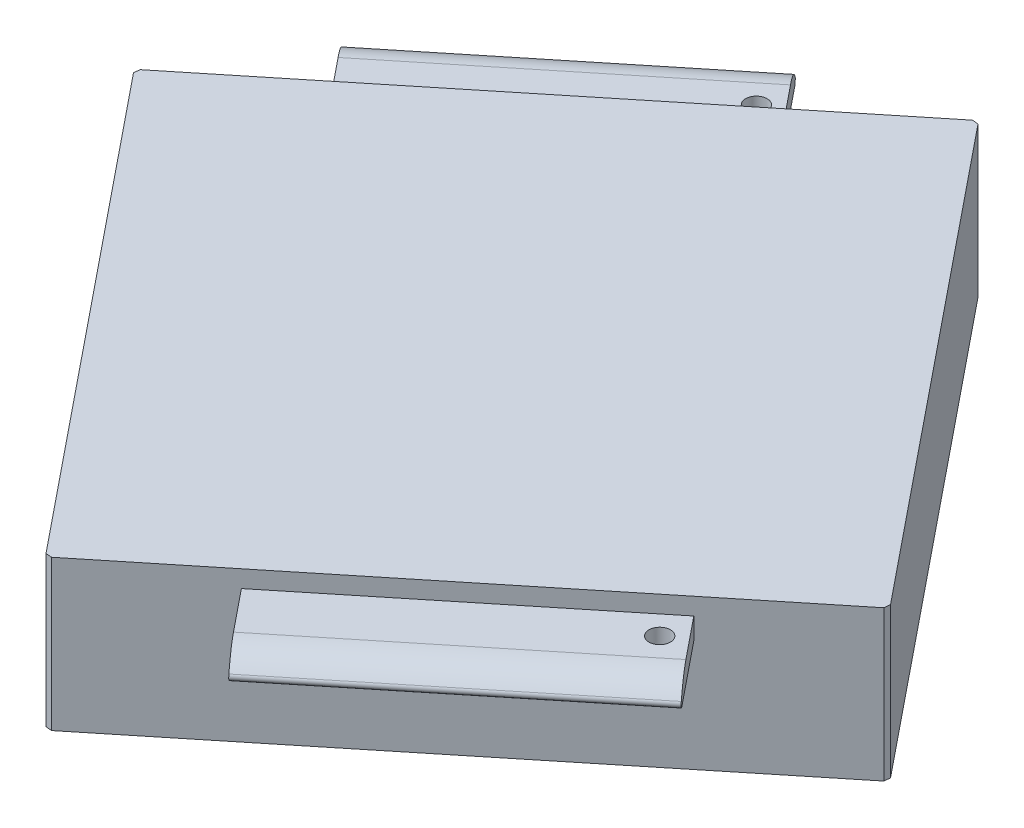
ISO-10303-21;
HEADER;
FILE_DESCRIPTION(('STEP AP214'),'2;1');
FILE_NAME('part.step','',(''),(''),'','','');
FILE_SCHEMA(('AUTOMOTIVE_DESIGN { 1 0 10303 214 1 1 1 1 }'));
ENDSEC;
DATA;
#1=APPLICATION_CONTEXT('core data for automotive mechanical design processes');
#2=APPLICATION_PROTOCOL_DEFINITION('international standard','automotive_design',2000,#1);
#3=PRODUCT_CONTEXT('',#1,'mechanical');
#4=PRODUCT('Part','Part','',(#3));
#5=PRODUCT_RELATED_PRODUCT_CATEGORY('part','',(#4));
#6=PRODUCT_DEFINITION_FORMATION('','',#4);
#7=PRODUCT_DEFINITION_CONTEXT('part definition',#1,'design');
#8=PRODUCT_DEFINITION('design','',#6,#7);
#9=PRODUCT_DEFINITION_SHAPE('','',#8);
#10=(LENGTH_UNIT() NAMED_UNIT(*) SI_UNIT(.MILLI.,.METRE.));
#11=(NAMED_UNIT(*) PLANE_ANGLE_UNIT() SI_UNIT($,.RADIAN.));
#12=(NAMED_UNIT(*) SI_UNIT($,.STERADIAN.) SOLID_ANGLE_UNIT());
#13=UNCERTAINTY_MEASURE_WITH_UNIT(LENGTH_MEASURE(1.E-05),#10,'distance_accuracy_value','');
#14=(GEOMETRIC_REPRESENTATION_CONTEXT(3) GLOBAL_UNCERTAINTY_ASSIGNED_CONTEXT((#13)) GLOBAL_UNIT_ASSIGNED_CONTEXT((#10,
#11,#12)) REPRESENTATION_CONTEXT('',''));
#15=CARTESIAN_POINT('',(0.,0.,0.));
#16=DIRECTION('',(0.,0.,1.));
#17=DIRECTION('',(1.,0.,0.));
#18=AXIS2_PLACEMENT_3D('',#15,#16,#17);
#19=CARTESIAN_POINT('',(-193.483264336636,940.,-1088.70823904463));
#20=DIRECTION('',(0.629320391049837,0.,0.777145961456971));
#21=DIRECTION('',(0.777145961456971,0.,-0.629320391049837));
#22=AXIS2_PLACEMENT_3D('',#19,#20,#21);
#23=PLANE('',#22);
#24=DIRECTION('',(-0.777145961456971,0.,0.629320391049837));
#25=VECTOR('',#24,1.);
#26=CARTESIAN_POINT('',(-193.483264336636,870.,-1088.70823904463));
#27=LINE('',#26,#25);
#28=CARTESIAN_POINT('',(-193.483264336636,870.,-1088.70823904463));
#29=VERTEX_POINT('',#28);
#30=CARTESIAN_POINT('',(-407.975549698759,870.,-915.015811114875));
#31=VERTEX_POINT('',#30);
#32=EDGE_CURVE('E235',#29,#31,#27,.T.);
#33=ORIENTED_EDGE('',*,*,#32,.F.);
#34=DIRECTION('',(0.,-1.,0.));
#35=VECTOR('',#34,1.);
#36=CARTESIAN_POINT('',(-193.483264336636,940.,-1088.70823904463));
#37=LINE('',#36,#35);
#38=CARTESIAN_POINT('',(-193.483264336636,940.,-1088.70823904463));
#39=VERTEX_POINT('',#38);
#40=EDGE_CURVE('E11',#39,#29,#37,.T.);
#41=ORIENTED_EDGE('',*,*,#40,.F.);
#42=DIRECTION('',(-0.777145961456971,0.,0.629320391049837));
#43=VECTOR('',#42,1.);
#44=CARTESIAN_POINT('',(-193.483264336636,940.,-1088.70823904463));
#45=LINE('',#44,#43);
#46=CARTESIAN_POINT('',(-407.975549698759,940.,-915.015811114875));
#47=VERTEX_POINT('',#46);
#48=EDGE_CURVE('E259',#39,#47,#45,.T.);
#49=ORIENTED_EDGE('',*,*,#48,.T.);
#50=DIRECTION('',(0.,-1.,0.));
#51=VECTOR('',#50,1.);
#52=CARTESIAN_POINT('',(-407.975549698759,940.,-915.015811114875));
#53=LINE('',#52,#51);
#54=EDGE_CURVE('E25',#47,#31,#53,.T.);
#55=ORIENTED_EDGE('',*,*,#54,.T.);
#56=EDGE_LOOP('',(#33,#41,#49,#55));
#57=FACE_BOUND('',#56,.T.);
#58=DIRECTION('',(-0.777145961456971,0.,0.629320391049837));
#59=VECTOR('',#58,1.);
#60=CARTESIAN_POINT('',(-242.443459908425,932.,-1049.06105440849));
#61=LINE('',#60,#59);
#62=CARTESIAN_POINT('',(-242.443459908425,932.,-1049.06105440849));
#63=VERTEX_POINT('',#62);
#64=CARTESIAN_POINT('',(-359.015354126971,932.,-954.662995751015));
#65=VERTEX_POINT('',#64);
#66=EDGE_CURVE('E32',#63,#65,#61,.T.);
#67=ORIENTED_EDGE('',*,*,#66,.F.);
#68=DIRECTION('',(0.,-1.,0.));
#69=VECTOR('',#68,1.);
#70=CARTESIAN_POINT('',(-242.443459908425,932.,-1049.06105440849));
#71=LINE('',#70,#69);
#72=CARTESIAN_POINT('',(-242.443459908425,922.,-1049.06105440849));
#73=VERTEX_POINT('',#72);
#74=EDGE_CURVE('E36',#63,#73,#71,.T.);
#75=ORIENTED_EDGE('',*,*,#74,.T.);
#76=DIRECTION('',(-0.777145961456971,0.,0.629320391049837));
#77=VECTOR('',#76,1.);
#78=CARTESIAN_POINT('',(-242.443459908425,922.,-1049.06105440849));
#79=LINE('',#78,#77);
#80=CARTESIAN_POINT('',(-359.015354126971,922.,-954.662995751015));
#81=VERTEX_POINT('',#80);
#82=EDGE_CURVE('E136',#73,#81,#79,.T.);
#83=ORIENTED_EDGE('',*,*,#82,.T.);
#84=DIRECTION('',(0.,-1.,0.));
#85=VECTOR('',#84,1.);
#86=CARTESIAN_POINT('',(-359.015354126971,932.,-954.662995751015));
#87=LINE('',#86,#85);
#88=EDGE_CURVE('E139',#65,#81,#87,.T.);
#89=ORIENTED_EDGE('',*,*,#88,.F.);
#90=EDGE_LOOP('',(#67,#75,#83,#89));
#91=FACE_BOUND('',#90,.T.);
#92=ADVANCED_FACE('F17',(#57,#91),#23,.T.);
#93=CARTESIAN_POINT('',(-193.187613195821,940.,-1091.52117174964));
#94=DIRECTION('',(0.994521895368274,0.,0.104528463267653));
#95=DIRECTION('',(0.104528463267653,0.,-0.994521895368274));
#96=AXIS2_PLACEMENT_3D('',#93,#94,#95);
#97=PLANE('',#96);
#98=DIRECTION('',(-0.104528463267653,0.,0.994521895368273));
#99=VECTOR('',#98,1.);
#100=CARTESIAN_POINT('',(-193.187613195821,870.,-1091.52117174964));
#101=LINE('',#100,#99);
#102=CARTESIAN_POINT('',(-193.187613195821,870.,-1091.52117174964));
#103=VERTEX_POINT('',#102);
#104=EDGE_CURVE('E232',#103,#29,#101,.T.);
#105=ORIENTED_EDGE('',*,*,#104,.F.);
#106=DIRECTION('',(0.,-1.,0.));
#107=VECTOR('',#106,1.);
#108=CARTESIAN_POINT('',(-193.187613195821,940.,-1091.52117174964));
#109=LINE('',#108,#107);
#110=CARTESIAN_POINT('',(-193.187613195821,940.,-1091.52117174964));
#111=VERTEX_POINT('',#110);
#112=EDGE_CURVE('E280',#111,#103,#109,.T.);
#113=ORIENTED_EDGE('',*,*,#112,.F.);
#114=DIRECTION('',(-0.104528463267653,0.,0.994521895368273));
#115=VECTOR('',#114,1.);
#116=CARTESIAN_POINT('',(-193.187613195821,940.,-1091.52117174964));
#117=LINE('',#116,#115);
#118=EDGE_CURVE('E256',#111,#39,#117,.T.);
#119=ORIENTED_EDGE('',*,*,#118,.T.);
#120=ORIENTED_EDGE('',*,*,#40,.T.);
#121=EDGE_LOOP('',(#105,#113,#119,#120));
#122=FACE_BOUND('',#121,.T.);
#123=ADVANCED_FACE('F19',(#122),#97,.T.);
#124=CARTESIAN_POINT('',(-407.975549698759,940.,-915.015811114875));
#125=DIRECTION('',(-0.104528463267653,0.,0.994521895368273));
#126=DIRECTION('',(0.994521895368273,0.,0.104528463267653));
#127=AXIS2_PLACEMENT_3D('',#124,#125,#126);
#128=PLANE('',#127);
#129=DIRECTION('',(-0.994521895368273,0.,-0.104528463267653));
#130=VECTOR('',#129,1.);
#131=CARTESIAN_POINT('',(-407.975549698759,870.,-915.015811114875));
#132=LINE('',#131,#130);
#133=CARTESIAN_POINT('',(-410.788482403773,870.,-915.311462255689));
#134=VERTEX_POINT('',#133);
#135=EDGE_CURVE('E238',#31,#134,#132,.T.);
#136=ORIENTED_EDGE('',*,*,#135,.F.);
#137=ORIENTED_EDGE('',*,*,#54,.F.);
#138=DIRECTION('',(-0.994521895368273,0.,-0.104528463267653));
#139=VECTOR('',#138,1.);
#140=CARTESIAN_POINT('',(-407.975549698759,940.,-915.015811114875));
#141=LINE('',#140,#139);
#142=CARTESIAN_POINT('',(-410.788482403773,940.,-915.311462255689));
#143=VERTEX_POINT('',#142);
#144=EDGE_CURVE('E262',#47,#143,#141,.T.);
#145=ORIENTED_EDGE('',*,*,#144,.T.);
#146=DIRECTION('',(0.,-1.,0.));
#147=VECTOR('',#146,1.);
#148=CARTESIAN_POINT('',(-410.788482403773,940.,-915.311462255689));
#149=LINE('',#148,#147);
#150=EDGE_CURVE('E292',#143,#134,#149,.T.);
#151=ORIENTED_EDGE('',*,*,#150,.T.);
#152=EDGE_LOOP('',(#136,#137,#145,#151));
#153=FACE_BOUND('',#152,.T.);
#154=ADVANCED_FACE('F299',(#153),#128,.T.);
#155=CARTESIAN_POINT('',(-410.788482403773,940.,-915.311462255689));
#156=DIRECTION('',(-0.777145961456971,0.,0.629320391049838));
#157=DIRECTION('',(0.629320391049838,0.,0.777145961456971));
#158=AXIS2_PLACEMENT_3D('',#155,#156,#157);
#159=PLANE('',#158);
#160=DIRECTION('',(-0.629320391049838,0.,-0.777145961456971));
#161=VECTOR('',#160,1.);
#162=CARTESIAN_POINT('',(-410.788482403773,870.,-915.311462255689));
#163=LINE('',#162,#161);
#164=CARTESIAN_POINT('',(-584.480910333528,870.,-1129.80374761781));
#165=VERTEX_POINT('',#164);
#166=EDGE_CURVE('E241',#134,#165,#163,.T.);
#167=ORIENTED_EDGE('',*,*,#166,.F.);
#168=ORIENTED_EDGE('',*,*,#150,.F.);
#169=DIRECTION('',(-0.629320391049838,0.,-0.777145961456971));
#170=VECTOR('',#169,1.);
#171=CARTESIAN_POINT('',(-410.788482403773,940.,-915.311462255689));
#172=LINE('',#171,#170);
#173=CARTESIAN_POINT('',(-584.480910333528,940.,-1129.80374761781));
#174=VERTEX_POINT('',#173);
#175=EDGE_CURVE('E265',#143,#174,#172,.T.);
#176=ORIENTED_EDGE('',*,*,#175,.T.);
#177=DIRECTION('',(0.,-1.,0.));
#178=VECTOR('',#177,1.);
#179=CARTESIAN_POINT('',(-584.480910333528,940.,-1129.80374761781));
#180=LINE('',#179,#178);
#181=EDGE_CURVE('E290',#174,#165,#180,.T.);
#182=ORIENTED_EDGE('',*,*,#181,.T.);
#183=EDGE_LOOP('',(#167,#168,#176,#182));
#184=FACE_BOUND('',#183,.T.);
#185=ADVANCED_FACE('F314',(#184),#159,.T.);
#186=CARTESIAN_POINT('',(-584.480910333528,940.,-1129.80374761781));
#187=DIRECTION('',(-0.994521895368274,0.,-0.104528463267653));
#188=DIRECTION('',(-0.104528463267653,0.,0.994521895368274));
#189=AXIS2_PLACEMENT_3D('',#186,#187,#188);
#190=PLANE('',#189);
#191=DIRECTION('',(0.104528463267653,0.,-0.994521895368273));
#192=VECTOR('',#191,1.);
#193=CARTESIAN_POINT('',(-584.480910333528,870.,-1129.80374761781));
#194=LINE('',#193,#192);
#195=CARTESIAN_POINT('',(-584.185259192714,870.,-1132.61668032283));
#196=VERTEX_POINT('',#195);
#197=EDGE_CURVE('E244',#165,#196,#194,.T.);
#198=ORIENTED_EDGE('',*,*,#197,.F.);
#199=ORIENTED_EDGE('',*,*,#181,.F.);
#200=DIRECTION('',(0.104528463267653,0.,-0.994521895368273));
#201=VECTOR('',#200,1.);
#202=CARTESIAN_POINT('',(-584.480910333528,940.,-1129.80374761781));
#203=LINE('',#202,#201);
#204=CARTESIAN_POINT('',(-584.185259192714,940.,-1132.61668032283));
#205=VERTEX_POINT('',#204);
#206=EDGE_CURVE('E268',#174,#205,#203,.T.);
#207=ORIENTED_EDGE('',*,*,#206,.T.);
#208=DIRECTION('',(0.,-1.,0.));
#209=VECTOR('',#208,1.);
#210=CARTESIAN_POINT('',(-584.185259192714,940.,-1132.61668032283));
#211=LINE('',#210,#209);
#212=EDGE_CURVE('E288',#205,#196,#211,.T.);
#213=ORIENTED_EDGE('',*,*,#212,.T.);
#214=EDGE_LOOP('',(#198,#199,#207,#213));
#215=FACE_BOUND('',#214,.T.);
#216=ADVANCED_FACE('F318',(#215),#190,.T.);
#217=CARTESIAN_POINT('',(-584.185259192714,940.,-1132.61668032283));
#218=DIRECTION('',(-0.629320391049837,0.,-0.777145961456971));
#219=DIRECTION('',(-0.777145961456971,0.,0.629320391049837));
#220=AXIS2_PLACEMENT_3D('',#217,#218,#219);
#221=PLANE('',#220);
#222=DIRECTION('',(0.,-1.,0.));
#223=VECTOR('',#222,1.);
#224=CARTESIAN_POINT('',(-418.653169402379,932.,-1266.66192361644));
#225=LINE('',#224,#223);
#226=CARTESIAN_POINT('',(-418.653169402379,932.,-1266.66192361644));
#227=VERTEX_POINT('',#226);
#228=CARTESIAN_POINT('',(-418.653169402379,922.,-1266.66192361644));
#229=VERTEX_POINT('',#228);
#230=EDGE_CURVE('E205',#227,#229,#225,.T.);
#231=ORIENTED_EDGE('',*,*,#230,.F.);
#232=DIRECTION('',(-0.777145961456971,0.,0.629320391049838));
#233=VECTOR('',#232,1.);
#234=CARTESIAN_POINT('',(-418.653169402379,932.,-1266.66192361644));
#235=LINE('',#234,#233);
#236=CARTESIAN_POINT('',(-535.225063620925,932.,-1172.26386495897));
#237=VERTEX_POINT('',#236);
#238=EDGE_CURVE('E230',#227,#237,#235,.T.);
#239=ORIENTED_EDGE('',*,*,#238,.T.);
#240=DIRECTION('',(0.,-1.,0.));
#241=VECTOR('',#240,1.);
#242=CARTESIAN_POINT('',(-535.225063620925,932.,-1172.26386495897));
#243=LINE('',#242,#241);
#244=CARTESIAN_POINT('',(-535.225063620925,922.,-1172.26386495897));
#245=VERTEX_POINT('',#244);
#246=EDGE_CURVE('E191',#237,#245,#243,.T.);
#247=ORIENTED_EDGE('',*,*,#246,.T.);
#248=DIRECTION('',(-0.777145961456971,0.,0.629320391049838));
#249=VECTOR('',#248,1.);
#250=CARTESIAN_POINT('',(-418.653169402379,922.,-1266.66192361644));
#251=LINE('',#250,#249);
#252=EDGE_CURVE('E227',#229,#245,#251,.T.);
#253=ORIENTED_EDGE('',*,*,#252,.F.);
#254=EDGE_LOOP('',(#231,#239,#247,#253));
#255=FACE_BOUND('',#254,.T.);
#256=DIRECTION('',(0.777145961456971,0.,-0.629320391049837));
#257=VECTOR('',#256,1.);
#258=CARTESIAN_POINT('',(-584.185259192714,870.,-1132.61668032283));
#259=LINE('',#258,#257);
#260=CARTESIAN_POINT('',(-369.69297383059,870.,-1306.30910825258));
#261=VERTEX_POINT('',#260);
#262=EDGE_CURVE('E247',#196,#261,#259,.T.);
#263=ORIENTED_EDGE('',*,*,#262,.F.);
#264=ORIENTED_EDGE('',*,*,#212,.F.);
#265=DIRECTION('',(0.777145961456971,0.,-0.629320391049837));
#266=VECTOR('',#265,1.);
#267=CARTESIAN_POINT('',(-584.185259192714,940.,-1132.61668032283));
#268=LINE('',#267,#266);
#269=CARTESIAN_POINT('',(-369.69297383059,940.,-1306.30910825258));
#270=VERTEX_POINT('',#269);
#271=EDGE_CURVE('E271',#205,#270,#268,.T.);
#272=ORIENTED_EDGE('',*,*,#271,.T.);
#273=DIRECTION('',(0.,-1.,0.));
#274=VECTOR('',#273,1.);
#275=CARTESIAN_POINT('',(-369.69297383059,940.,-1306.30910825258));
#276=LINE('',#275,#274);
#277=EDGE_CURVE('E286',#270,#261,#276,.T.);
#278=ORIENTED_EDGE('',*,*,#277,.T.);
#279=EDGE_LOOP('',(#263,#264,#272,#278));
#280=FACE_BOUND('',#279,.T.);
#281=ADVANCED_FACE('F320',(#255,#280),#221,.T.);
#282=CARTESIAN_POINT('',(-369.69297383059,940.,-1306.30910825258));
#283=DIRECTION('',(0.104528463267653,0.,-0.994521895368274));
#284=DIRECTION('',(-0.994521895368274,0.,-0.104528463267653));
#285=AXIS2_PLACEMENT_3D('',#282,#283,#284);
#286=PLANE('',#285);
#287=DIRECTION('',(0.994521895368273,0.,0.104528463267653));
#288=VECTOR('',#287,1.);
#289=CARTESIAN_POINT('',(-369.69297383059,870.,-1306.30910825258));
#290=LINE('',#289,#288);
#291=CARTESIAN_POINT('',(-366.880041125576,870.,-1306.01345711177));
#292=VERTEX_POINT('',#291);
#293=EDGE_CURVE('E250',#261,#292,#290,.T.);
#294=ORIENTED_EDGE('',*,*,#293,.F.);
#295=ORIENTED_EDGE('',*,*,#277,.F.);
#296=DIRECTION('',(0.994521895368273,0.,0.104528463267653));
#297=VECTOR('',#296,1.);
#298=CARTESIAN_POINT('',(-369.69297383059,940.,-1306.30910825258));
#299=LINE('',#298,#297);
#300=CARTESIAN_POINT('',(-366.880041125576,940.,-1306.01345711177));
#301=VERTEX_POINT('',#300);
#302=EDGE_CURVE('E274',#270,#301,#299,.T.);
#303=ORIENTED_EDGE('',*,*,#302,.T.);
#304=DIRECTION('',(0.,-1.,0.));
#305=VECTOR('',#304,1.);
#306=CARTESIAN_POINT('',(-366.880041125576,940.,-1306.01345711177));
#307=LINE('',#306,#305);
#308=EDGE_CURVE('E284',#301,#292,#307,.T.);
#309=ORIENTED_EDGE('',*,*,#308,.T.);
#310=EDGE_LOOP('',(#294,#295,#303,#309));
#311=FACE_BOUND('',#310,.T.);
#312=ADVANCED_FACE('F324',(#311),#286,.T.);
#313=CARTESIAN_POINT('',(-366.880041125576,940.,-1306.01345711177));
#314=DIRECTION('',(0.777145961456971,0.,-0.629320391049838));
#315=DIRECTION('',(-0.629320391049838,0.,-0.777145961456971));
#316=AXIS2_PLACEMENT_3D('',#313,#314,#315);
#317=PLANE('',#316);
#318=DIRECTION('',(0.629320391049838,0.,0.777145961456971));
#319=VECTOR('',#318,1.);
#320=CARTESIAN_POINT('',(-366.880041125576,870.,-1306.01345711177));
#321=LINE('',#320,#319);
#322=EDGE_CURVE('E253',#292,#103,#321,.T.);
#323=ORIENTED_EDGE('',*,*,#322,.F.);
#324=ORIENTED_EDGE('',*,*,#308,.F.);
#325=DIRECTION('',(0.629320391049838,0.,0.777145961456971));
#326=VECTOR('',#325,1.);
#327=CARTESIAN_POINT('',(-366.880041125576,940.,-1306.01345711177));
#328=LINE('',#327,#326);
#329=EDGE_CURVE('E277',#301,#111,#328,.T.);
#330=ORIENTED_EDGE('',*,*,#329,.T.);
#331=ORIENTED_EDGE('',*,*,#112,.T.);
#332=EDGE_LOOP('',(#323,#324,#330,#331));
#333=FACE_BOUND('',#332,.T.);
#334=ADVANCED_FACE('F326',(#333),#317,.T.);
#335=CARTESIAN_POINT('',(-213.88319305282,940.,-894.615882398691));
#336=DIRECTION('',(0.,-1.,0.));
#337=DIRECTION('',(0.629320391049837,0.,0.777145961456971));
#338=AXIS2_PLACEMENT_3D('',#335,#336,#337);
#339=PLANE('',#338);
#340=ORIENTED_EDGE('',*,*,#118,.F.);
#341=ORIENTED_EDGE('',*,*,#329,.F.);
#342=ORIENTED_EDGE('',*,*,#302,.F.);
#343=ORIENTED_EDGE('',*,*,#271,.F.);
#344=ORIENTED_EDGE('',*,*,#206,.F.);
#345=ORIENTED_EDGE('',*,*,#175,.F.);
#346=ORIENTED_EDGE('',*,*,#144,.F.);
#347=ORIENTED_EDGE('',*,*,#48,.F.);
#348=EDGE_LOOP('',(#340,#341,#342,#343,#344,#345,#346,#347));
#349=FACE_BOUND('',#348,.T.);
#350=ADVANCED_FACE('F308',(#349),#339,.F.);
#351=CARTESIAN_POINT('',(-213.88319305282,870.,-894.615882398691));
#352=DIRECTION('',(0.,-1.,0.));
#353=DIRECTION('',(0.629320391049837,0.,0.777145961456971));
#354=AXIS2_PLACEMENT_3D('',#351,#352,#353);
#355=PLANE('',#354);
#356=ORIENTED_EDGE('',*,*,#104,.T.);
#357=ORIENTED_EDGE('',*,*,#32,.T.);
#358=ORIENTED_EDGE('',*,*,#135,.T.);
#359=ORIENTED_EDGE('',*,*,#166,.T.);
#360=ORIENTED_EDGE('',*,*,#197,.T.);
#361=ORIENTED_EDGE('',*,*,#262,.T.);
#362=ORIENTED_EDGE('',*,*,#293,.T.);
#363=ORIENTED_EDGE('',*,*,#322,.T.);
#364=EDGE_LOOP('',(#356,#357,#358,#359,#360,#361,#362,#363));
#365=FACE_BOUND('',#364,.T.);
#366=ADVANCED_FACE('F302',(#365),#355,.T.);
#367=CARTESIAN_POINT('',(-434.386179178623,932.,-1286.09057265286));
#368=DIRECTION('',(0.,1.,0.));
#369=DIRECTION('',(-0.629320391049838,0.,-0.777145961456971));
#370=AXIS2_PLACEMENT_3D('',#367,#368,#369);
#371=PLANE('',#370);
#372=CARTESIAN_POINT('',(-434.291133905071,932.,-1270.08304422416));
#373=DIRECTION('',(0.,1.,0.));
#374=DIRECTION('',(-0.629320391049837,0.,-0.777145961456971));
#375=AXIS2_PLACEMENT_3D('',#372,#373,#374);
#376=CIRCLE('',#375,5.);
#377=CARTESIAN_POINT('',(-437.437735860321,932.,-1273.96877403144));
#378=VERTEX_POINT('',#377);
#379=EDGE_CURVE('E185',#378,#378,#376,.T.);
#380=ORIENTED_EDGE('',*,*,#379,.F.);
#381=EDGE_LOOP('',(#380));
#382=FACE_BOUND('',#381,.T.);
#383=DIRECTION('',(0.629320391049838,0.,0.777145961456971));
#384=VECTOR('',#383,1.);
#385=CARTESIAN_POINT('',(-550.958073397169,932.,-1191.69251399539));
#386=LINE('',#385,#384);
#387=CARTESIAN_POINT('',(-550.958073397169,932.,-1191.69251399539));
#388=VERTEX_POINT('',#387);
#389=EDGE_CURVE('E194',#388,#237,#386,.T.);
#390=ORIENTED_EDGE('',*,*,#389,.T.);
#391=ORIENTED_EDGE('',*,*,#238,.F.);
#392=DIRECTION('',(0.629320391049838,0.,0.777145961456971));
#393=VECTOR('',#392,1.);
#394=CARTESIAN_POINT('',(-434.386179178623,932.,-1286.09057265286));
#395=LINE('',#394,#393);
#396=CARTESIAN_POINT('',(-434.386179178623,932.,-1286.09057265286));
#397=VERTEX_POINT('',#396);
#398=EDGE_CURVE('E202',#397,#227,#395,.T.);
#399=ORIENTED_EDGE('',*,*,#398,.F.);
#400=DIRECTION('',(-0.777145961456971,0.,0.629320391049838));
#401=VECTOR('',#400,1.);
#402=CARTESIAN_POINT('',(-434.386179178623,932.,-1286.09057265286));
#403=LINE('',#402,#401);
#404=EDGE_CURVE('E216',#397,#388,#403,.T.);
#405=ORIENTED_EDGE('',*,*,#404,.T.);
#406=EDGE_LOOP('',(#390,#391,#399,#405));
#407=FACE_BOUND('',#406,.T.);
#408=ADVANCED_FACE('F359',(#382,#407),#371,.T.);
#409=CARTESIAN_POINT('',(-418.653169402379,922.,-1266.66192361644));
#410=DIRECTION('',(0.,-1.,0.));
#411=DIRECTION('',(0.629320391049838,0.,0.777145961456971));
#412=AXIS2_PLACEMENT_3D('',#409,#410,#411);
#413=PLANE('',#412);
#414=CARTESIAN_POINT('',(-434.291133905071,922.,-1270.08304422416));
#415=DIRECTION('',(0.,1.,0.));
#416=DIRECTION('',(0.629320391049837,0.,0.777145961456971));
#417=AXIS2_PLACEMENT_3D('',#414,#415,#416);
#418=CIRCLE('',#417,5.);
#419=CARTESIAN_POINT('',(-431.144531949822,922.,-1266.19731441687));
#420=VERTEX_POINT('',#419);
#421=EDGE_CURVE('E190',#420,#420,#418,.T.);
#422=ORIENTED_EDGE('',*,*,#421,.T.);
#423=EDGE_LOOP('',(#422));
#424=FACE_BOUND('',#423,.T.);
#425=DIRECTION('',(-0.629320391049838,0.,-0.777145961456971));
#426=VECTOR('',#425,1.);
#427=CARTESIAN_POINT('',(-535.225063620925,922.,-1172.26386495897));
#428=LINE('',#427,#426);
#429=CARTESIAN_POINT('',(-559.139238480819,922.,-1201.79541149433));
#430=VERTEX_POINT('',#429);
#431=EDGE_CURVE('E193',#245,#430,#428,.T.);
#432=ORIENTED_EDGE('',*,*,#431,.T.);
#433=DIRECTION('',(-0.777145961456971,0.,0.629320391049838));
#434=VECTOR('',#433,1.);
#435=CARTESIAN_POINT('',(-442.567344262273,922.,-1296.19347015181));
#436=LINE('',#435,#434);
#437=CARTESIAN_POINT('',(-442.567344262273,922.,-1296.19347015181));
#438=VERTEX_POINT('',#437);
#439=EDGE_CURVE('E224',#438,#430,#436,.T.);
#440=ORIENTED_EDGE('',*,*,#439,.F.);
#441=DIRECTION('',(-0.629320391049838,0.,-0.777145961456971));
#442=VECTOR('',#441,1.);
#443=CARTESIAN_POINT('',(-418.653169402379,922.,-1266.66192361644));
#444=LINE('',#443,#442);
#445=EDGE_CURVE('E208',#229,#438,#444,.T.);
#446=ORIENTED_EDGE('',*,*,#445,.F.);
#447=ORIENTED_EDGE('',*,*,#252,.T.);
#448=EDGE_LOOP('',(#432,#440,#446,#447));
#449=FACE_BOUND('',#448,.T.);
#450=ADVANCED_FACE('F366',(#424,#449),#413,.T.);
#451=CARTESIAN_POINT('',(-442.567344262273,924.,-1296.19347015181));
#452=DIRECTION('',(-0.777145961456971,0.,0.629320391049838));
#453=DIRECTION('',(0.629320391049838,0.,0.777145961456971));
#454=AXIS2_PLACEMENT_3D('',#451,#452,#453);
#455=CYLINDRICAL_SURFACE('',#454,2.);
#456=CARTESIAN_POINT('',(-559.139238480819,924.,-1201.79541149433));
#457=DIRECTION('',(0.777145961456971,0.,-0.629320391049838));
#458=DIRECTION('',(0.,-1.,0.));
#459=AXIS2_PLACEMENT_3D('',#456,#457,#458);
#460=CIRCLE('',#459,2.);
#461=CARTESIAN_POINT('',(-560.09887911121,925.294113061495,-1202.9804689801));
#462=VERTEX_POINT('',#461);
#463=EDGE_CURVE('E197',#430,#462,#460,.T.);
#464=ORIENTED_EDGE('',*,*,#463,.T.);
#465=DIRECTION('',(-0.777145961456971,0.,0.629320391049838));
#466=VECTOR('',#465,1.);
#467=CARTESIAN_POINT('',(-443.526984892665,925.294113061495,-1297.37852763757));
#468=LINE('',#467,#466);
#469=CARTESIAN_POINT('',(-443.526984892665,925.294113061495,-1297.37852763757));
#470=VERTEX_POINT('',#469);
#471=EDGE_CURVE('E221',#470,#462,#468,.T.);
#472=ORIENTED_EDGE('',*,*,#471,.F.);
#473=CARTESIAN_POINT('',(-442.567344262273,924.,-1296.19347015181));
#474=DIRECTION('',(0.777145961456971,0.,-0.629320391049838));
#475=DIRECTION('',(0.,-1.,0.));
#476=AXIS2_PLACEMENT_3D('',#473,#474,#475);
#477=CIRCLE('',#476,2.);
#478=EDGE_CURVE('E211',#438,#470,#477,.T.);
#479=ORIENTED_EDGE('',*,*,#478,.F.);
#480=ORIENTED_EDGE('',*,*,#439,.T.);
#481=EDGE_LOOP('',(#464,#472,#479,#480));
#482=FACE_BOUND('',#481,.T.);
#483=ADVANCED_FACE('F369',(#482),#455,.T.);
#484=CARTESIAN_POINT('',(-434.410398903945,913.000038977292,-1286.1204815228));
#485=DIRECTION('',(-0.777145961456971,0.,0.629320391049838));
#486=DIRECTION('',(0.629320391049838,0.,0.777145961456971));
#487=AXIS2_PLACEMENT_3D('',#484,#485,#486);
#488=CYLINDRICAL_SURFACE('',#487,19.);
#489=CARTESIAN_POINT('',(-550.982293122491,913.000038977292,-1191.72242286532));
#490=DIRECTION('',(0.777145961456972,0.,-0.629320391049837));
#491=DIRECTION('',(0.00127472238528323,0.999997948563554,0.00157415104895562));
#492=AXIS2_PLACEMENT_3D('',#489,#490,#491);
#493=CIRCLE('',#492,19.);
#494=EDGE_CURVE('E200',#462,#388,#493,.T.);
#495=ORIENTED_EDGE('',*,*,#494,.T.);
#496=ORIENTED_EDGE('',*,*,#404,.F.);
#497=CARTESIAN_POINT('',(-434.410398903945,913.000038977292,-1286.1204815228));
#498=DIRECTION('',(0.777145961456972,0.,-0.629320391049837));
#499=DIRECTION('',(0.00127472238528323,0.999997948563554,0.00157415104895562));
#500=AXIS2_PLACEMENT_3D('',#497,#498,#499);
#501=CIRCLE('',#500,19.);
#502=EDGE_CURVE('E214',#470,#397,#501,.T.);
#503=ORIENTED_EDGE('',*,*,#502,.F.);
#504=ORIENTED_EDGE('',*,*,#471,.T.);
#505=EDGE_LOOP('',(#495,#496,#503,#504));
#506=FACE_BOUND('',#505,.T.);
#507=ADVANCED_FACE('F371',(#506),#488,.T.);
#508=CARTESIAN_POINT('',(-442.567344262273,924.,-1296.19347015181));
#509=DIRECTION('',(-0.777145961456971,0.,0.629320391049838));
#510=DIRECTION('',(0.629320391049838,0.,0.777145961456971));
#511=AXIS2_PLACEMENT_3D('',#508,#509,#510);
#512=PLANE('',#511);
#513=ORIENTED_EDGE('',*,*,#398,.T.);
#514=ORIENTED_EDGE('',*,*,#230,.T.);
#515=ORIENTED_EDGE('',*,*,#445,.T.);
#516=ORIENTED_EDGE('',*,*,#478,.T.);
#517=ORIENTED_EDGE('',*,*,#502,.T.);
#518=EDGE_LOOP('',(#513,#514,#515,#516,#517));
#519=FACE_BOUND('',#518,.T.);
#520=ADVANCED_FACE('F356',(#519),#512,.F.);
#521=CARTESIAN_POINT('',(-559.139238480819,924.,-1201.79541149433));
#522=DIRECTION('',(-0.777145961456971,0.,0.629320391049838));
#523=DIRECTION('',(0.629320391049838,0.,0.777145961456971));
#524=AXIS2_PLACEMENT_3D('',#521,#522,#523);
#525=PLANE('',#524);
#526=ORIENTED_EDGE('',*,*,#389,.F.);
#527=ORIENTED_EDGE('',*,*,#494,.F.);
#528=ORIENTED_EDGE('',*,*,#463,.F.);
#529=ORIENTED_EDGE('',*,*,#431,.F.);
#530=ORIENTED_EDGE('',*,*,#246,.F.);
#531=EDGE_LOOP('',(#526,#527,#528,#529,#530));
#532=FACE_BOUND('',#531,.T.);
#533=ADVANCED_FACE('F362',(#532),#525,.T.);
#534=CARTESIAN_POINT('',(-434.291133905071,916.999999999951,-1270.08304422416));
#535=DIRECTION('',(0.,1.,0.));
#536=DIRECTION('',(-0.629320391049837,0.,-0.777145961456971));
#537=AXIS2_PLACEMENT_3D('',#534,#535,#536);
#538=CYLINDRICAL_SURFACE('',#537,5.);
#539=ORIENTED_EDGE('',*,*,#421,.F.);
#540=EDGE_LOOP('',(#539));
#541=FACE_BOUND('',#540,.T.);
#542=ORIENTED_EDGE('',*,*,#379,.T.);
#543=EDGE_LOOP('',(#542));
#544=FACE_BOUND('',#543,.T.);
#545=ADVANCED_FACE('F434',(#541,#544),#538,.F.);
#546=CARTESIAN_POINT('',(-226.71045013218,932.,-1029.63240537207));
#547=DIRECTION('',(0.,1.,0.));
#548=DIRECTION('',(0.629320391049837,0.,0.777145961456971));
#549=AXIS2_PLACEMENT_3D('',#546,#547,#548);
#550=PLANE('',#549);
#551=CARTESIAN_POINT('',(-242.348414634871,932.,-1033.05352597978));
#552=DIRECTION('',(0.,-1.,0.));
#553=DIRECTION('',(0.629320391049837,0.,0.777145961456971));
#554=AXIS2_PLACEMENT_3D('',#551,#552,#553);
#555=CIRCLE('',#554,5.);
#556=CARTESIAN_POINT('',(-239.201812679622,932.,-1029.16779617249));
#557=VERTEX_POINT('',#556);
#558=EDGE_CURVE('E162',#557,#557,#555,.T.);
#559=ORIENTED_EDGE('',*,*,#558,.T.);
#560=EDGE_LOOP('',(#559));
#561=FACE_BOUND('',#560,.T.);
#562=DIRECTION('',(-0.629320391049837,0.,-0.777145961456971));
#563=VECTOR('',#562,1.);
#564=CARTESIAN_POINT('',(-343.282344350726,932.,-935.234346714593));
#565=LINE('',#564,#563);
#566=CARTESIAN_POINT('',(-343.282344350726,932.,-935.234346714593));
#567=VERTEX_POINT('',#566);
#568=EDGE_CURVE('E157',#567,#65,#565,.T.);
#569=ORIENTED_EDGE('',*,*,#568,.F.);
#570=DIRECTION('',(-0.777145961456971,0.,0.629320391049837));
#571=VECTOR('',#570,1.);
#572=CARTESIAN_POINT('',(-226.71045013218,932.,-1029.63240537207));
#573=LINE('',#572,#571);
#574=CARTESIAN_POINT('',(-226.71045013218,932.,-1029.63240537207));
#575=VERTEX_POINT('',#574);
#576=EDGE_CURVE('E177',#575,#567,#573,.T.);
#577=ORIENTED_EDGE('',*,*,#576,.F.);
#578=DIRECTION('',(-0.629320391049837,0.,-0.777145961456971));
#579=VECTOR('',#578,1.);
#580=CARTESIAN_POINT('',(-226.71045013218,932.,-1029.63240537207));
#581=LINE('',#580,#579);
#582=EDGE_CURVE('E166',#575,#63,#581,.T.);
#583=ORIENTED_EDGE('',*,*,#582,.T.);
#584=ORIENTED_EDGE('',*,*,#66,.T.);
#585=EDGE_LOOP('',(#569,#577,#583,#584));
#586=FACE_BOUND('',#585,.T.);
#587=ADVANCED_FACE('F442',(#561,#586),#550,.T.);
#588=CARTESIAN_POINT('',(-242.443459908425,922.,-1049.06105440849));
#589=DIRECTION('',(0.,-1.,0.));
#590=DIRECTION('',(-0.629320391049837,0.,-0.777145961456971));
#591=AXIS2_PLACEMENT_3D('',#588,#589,#590);
#592=PLANE('',#591);
#593=CARTESIAN_POINT('',(-242.348414634871,922.,-1033.05352597978));
#594=DIRECTION('',(0.,-1.,0.));
#595=DIRECTION('',(-0.629320391049838,0.,-0.777145961456971));
#596=AXIS2_PLACEMENT_3D('',#593,#594,#595);
#597=CIRCLE('',#596,5.);
#598=CARTESIAN_POINT('',(-245.495016590121,922.,-1036.93925578706));
#599=VERTEX_POINT('',#598);
#600=EDGE_CURVE('E159',#599,#599,#597,.T.);
#601=ORIENTED_EDGE('',*,*,#600,.F.);
#602=EDGE_LOOP('',(#601));
#603=FACE_BOUND('',#602,.T.);
#604=DIRECTION('',(0.629320391049837,0.,0.777145961456971));
#605=VECTOR('',#604,1.);
#606=CARTESIAN_POINT('',(-359.015354126971,922.,-954.662995751015));
#607=LINE('',#606,#605);
#608=CARTESIAN_POINT('',(-335.101179267077,922.,-925.13144921565));
#609=VERTEX_POINT('',#608);
#610=EDGE_CURVE('E146',#81,#609,#607,.T.);
#611=ORIENTED_EDGE('',*,*,#610,.F.);
#612=ORIENTED_EDGE('',*,*,#82,.F.);
#613=DIRECTION('',(0.629320391049837,0.,0.777145961456971));
#614=VECTOR('',#613,1.);
#615=CARTESIAN_POINT('',(-242.443459908425,922.,-1049.06105440849));
#616=LINE('',#615,#614);
#617=CARTESIAN_POINT('',(-218.529285048531,922.,-1019.52950787312));
#618=VERTEX_POINT('',#617);
#619=EDGE_CURVE('E169',#73,#618,#616,.T.);
#620=ORIENTED_EDGE('',*,*,#619,.T.);
#621=DIRECTION('',(-0.777145961456971,0.,0.629320391049837));
#622=VECTOR('',#621,1.);
#623=CARTESIAN_POINT('',(-218.529285048531,922.,-1019.52950787312));
#624=LINE('',#623,#622);
#625=EDGE_CURVE('E143',#618,#609,#624,.T.);
#626=ORIENTED_EDGE('',*,*,#625,.T.);
#627=EDGE_LOOP('',(#611,#612,#620,#626));
#628=FACE_BOUND('',#627,.T.);
#629=ADVANCED_FACE('F147',(#603,#628),#592,.T.);
#630=CARTESIAN_POINT('',(-218.529285048531,924.,-1019.52950787313));
#631=DIRECTION('',(-0.777145961456971,0.,0.629320391049837));
#632=DIRECTION('',(-0.629320391049837,0.,-0.777145961456971));
#633=AXIS2_PLACEMENT_3D('',#630,#631,#632);
#634=CYLINDRICAL_SURFACE('',#633,2.);
#635=CARTESIAN_POINT('',(-335.101179267077,924.,-925.13144921565));
#636=DIRECTION('',(-0.777145961456971,0.,0.629320391049837));
#637=DIRECTION('',(0.,-1.,0.));
#638=AXIS2_PLACEMENT_3D('',#635,#636,#637);
#639=CIRCLE('',#638,2.);
#640=CARTESIAN_POINT('',(-334.141538636685,925.294113061495,-923.946391729884));
#641=VERTEX_POINT('',#640);
#642=EDGE_CURVE('E151',#609,#641,#639,.T.);
#643=ORIENTED_EDGE('',*,*,#642,.F.);
#644=ORIENTED_EDGE('',*,*,#625,.F.);
#645=CARTESIAN_POINT('',(-218.529285048531,924.,-1019.52950787313));
#646=DIRECTION('',(-0.777145961456971,0.,0.629320391049837));
#647=DIRECTION('',(0.,-1.,0.));
#648=AXIS2_PLACEMENT_3D('',#645,#646,#647);
#649=CIRCLE('',#648,2.);
#650=CARTESIAN_POINT('',(-217.569644418139,925.294113061495,-1018.34445038736));
#651=VERTEX_POINT('',#650);
#652=EDGE_CURVE('E171',#618,#651,#649,.T.);
#653=ORIENTED_EDGE('',*,*,#652,.T.);
#654=DIRECTION('',(-0.777145961456971,0.,0.629320391049837));
#655=VECTOR('',#654,1.);
#656=CARTESIAN_POINT('',(-217.569644418139,925.294113061495,-1018.34445038736));
#657=LINE('',#656,#655);
#658=EDGE_CURVE('E181',#651,#641,#657,.T.);
#659=ORIENTED_EDGE('',*,*,#658,.T.);
#660=EDGE_LOOP('',(#643,#644,#653,#659));
#661=FACE_BOUND('',#660,.T.);
#662=ADVANCED_FACE('F461',(#661),#634,.T.);
#663=CARTESIAN_POINT('',(-226.686230406858,913.000038977292,-1029.60249650214));
#664=DIRECTION('',(-0.777145961456971,0.,0.629320391049837));
#665=DIRECTION('',(-0.629320391049837,0.,-0.777145961456971));
#666=AXIS2_PLACEMENT_3D('',#663,#664,#665);
#667=CYLINDRICAL_SURFACE('',#666,19.);
#668=CARTESIAN_POINT('',(-343.258124625404,913.000038977292,-935.20443784466));
#669=DIRECTION('',(-0.777145961456971,0.,0.629320391049838));
#670=DIRECTION('',(-0.00127472238528124,0.999997948563554,-0.0015741510489576));
#671=AXIS2_PLACEMENT_3D('',#668,#669,#670);
#672=CIRCLE('',#671,19.);
#673=EDGE_CURVE('E165',#641,#567,#672,.T.);
#674=ORIENTED_EDGE('',*,*,#673,.F.);
#675=ORIENTED_EDGE('',*,*,#658,.F.);
#676=CARTESIAN_POINT('',(-226.686230406858,913.000038977292,-1029.60249650214));
#677=DIRECTION('',(-0.777145961456971,0.,0.629320391049838));
#678=DIRECTION('',(-0.00127472238528124,0.999997948563554,-0.0015741510489576));
#679=AXIS2_PLACEMENT_3D('',#676,#677,#678);
#680=CIRCLE('',#679,19.);
#681=EDGE_CURVE('E174',#651,#575,#680,.T.);
#682=ORIENTED_EDGE('',*,*,#681,.T.);
#683=ORIENTED_EDGE('',*,*,#576,.T.);
#684=EDGE_LOOP('',(#674,#675,#682,#683));
#685=FACE_BOUND('',#684,.T.);
#686=ADVANCED_FACE('F471',(#685),#667,.T.);
#687=CARTESIAN_POINT('',(-218.529285048531,924.,-1019.52950787313));
#688=DIRECTION('',(-0.777145961456971,0.,0.629320391049837));
#689=DIRECTION('',(-0.629320391049837,0.,-0.777145961456971));
#690=AXIS2_PLACEMENT_3D('',#687,#688,#689);
#691=PLANE('',#690);
#692=ORIENTED_EDGE('',*,*,#582,.F.);
#693=ORIENTED_EDGE('',*,*,#681,.F.);
#694=ORIENTED_EDGE('',*,*,#652,.F.);
#695=ORIENTED_EDGE('',*,*,#619,.F.);
#696=ORIENTED_EDGE('',*,*,#74,.F.);
#697=EDGE_LOOP('',(#692,#693,#694,#695,#696));
#698=FACE_BOUND('',#697,.T.);
#699=ADVANCED_FACE('F481',(#698),#691,.F.);
#700=CARTESIAN_POINT('',(-335.101179267077,924.,-925.13144921565));
#701=DIRECTION('',(-0.777145961456971,0.,0.629320391049837));
#702=DIRECTION('',(-0.629320391049837,0.,-0.777145961456971));
#703=AXIS2_PLACEMENT_3D('',#700,#701,#702);
#704=PLANE('',#703);
#705=ORIENTED_EDGE('',*,*,#568,.T.);
#706=ORIENTED_EDGE('',*,*,#88,.T.);
#707=ORIENTED_EDGE('',*,*,#610,.T.);
#708=ORIENTED_EDGE('',*,*,#642,.T.);
#709=ORIENTED_EDGE('',*,*,#673,.T.);
#710=EDGE_LOOP('',(#705,#706,#707,#708,#709));
#711=FACE_BOUND('',#710,.T.);
#712=ADVANCED_FACE('F154',(#711),#704,.T.);
#713=CARTESIAN_POINT('',(-242.348414634871,916.999999999951,-1033.05352597978));
#714=DIRECTION('',(0.,1.,0.));
#715=DIRECTION('',(0.629320391049837,0.,0.777145961456971));
#716=AXIS2_PLACEMENT_3D('',#713,#714,#715);
#717=CYLINDRICAL_SURFACE('',#716,5.);
#718=ORIENTED_EDGE('',*,*,#600,.T.);
#719=EDGE_LOOP('',(#718));
#720=FACE_BOUND('',#719,.T.);
#721=ORIENTED_EDGE('',*,*,#558,.F.);
#722=EDGE_LOOP('',(#721));
#723=FACE_BOUND('',#722,.T.);
#724=ADVANCED_FACE('F500',(#720,#723),#717,.F.);
#725=CLOSED_SHELL('',(#92,#123,#154,#185,#216,#281,#312,#334,#350,#366,#408,#450,#483,#507,#520,
#533,#545,#587,#629,#662,#686,#699,#712,#724));
#726=MANIFOLD_SOLID_BREP('B1',#725);
#727=ADVANCED_BREP_SHAPE_REPRESENTATION('',(#18,#726),#14);
#728=SHAPE_DEFINITION_REPRESENTATION(#9,#727);
ENDSEC;
END-ISO-10303-21;
